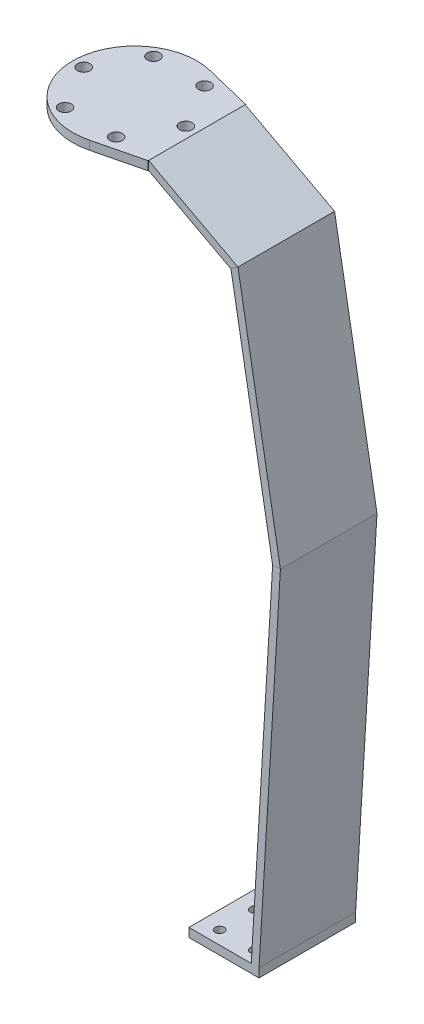
ISO-10303-21;
HEADER;
FILE_DESCRIPTION(('STEP AP214'),'2;1');
FILE_NAME('part.step','',(''),(''),'','','');
FILE_SCHEMA(('AUTOMOTIVE_DESIGN { 1 0 10303 214 1 1 1 1 }'));
ENDSEC;
DATA;
#1=APPLICATION_CONTEXT('core data for automotive mechanical design processes');
#2=APPLICATION_PROTOCOL_DEFINITION('international standard','automotive_design',2000,#1);
#3=PRODUCT_CONTEXT('',#1,'mechanical');
#4=PRODUCT('Part','Part','',(#3));
#5=PRODUCT_RELATED_PRODUCT_CATEGORY('part','',(#4));
#6=PRODUCT_DEFINITION_FORMATION('','',#4);
#7=PRODUCT_DEFINITION_CONTEXT('part definition',#1,'design');
#8=PRODUCT_DEFINITION('design','',#6,#7);
#9=PRODUCT_DEFINITION_SHAPE('','',#8);
#10=(LENGTH_UNIT() NAMED_UNIT(*) SI_UNIT(.MILLI.,.METRE.));
#11=(NAMED_UNIT(*) PLANE_ANGLE_UNIT() SI_UNIT($,.RADIAN.));
#12=(NAMED_UNIT(*) SI_UNIT($,.STERADIAN.) SOLID_ANGLE_UNIT());
#13=UNCERTAINTY_MEASURE_WITH_UNIT(LENGTH_MEASURE(1.E-05),#10,'distance_accuracy_value','');
#14=(GEOMETRIC_REPRESENTATION_CONTEXT(3) GLOBAL_UNCERTAINTY_ASSIGNED_CONTEXT((#13)) GLOBAL_UNIT_ASSIGNED_CONTEXT((#10,
#11,#12)) REPRESENTATION_CONTEXT('',''));
#15=CARTESIAN_POINT('',(0.,0.,0.));
#16=DIRECTION('',(0.,0.,1.));
#17=DIRECTION('',(1.,0.,0.));
#18=AXIS2_PLACEMENT_3D('',#15,#16,#17);
#19=CARTESIAN_POINT('',(62.5,3.175,0.));
#20=DIRECTION('',(1.,0.,0.));
#21=DIRECTION('',(0.,0.,-1.));
#22=AXIS2_PLACEMENT_3D('',#19,#20,#21);
#23=PLANE('',#22);
#24=DIRECTION('',(0.,0.,1.));
#25=VECTOR('',#24,1.);
#26=CARTESIAN_POINT('',(62.5,0.,0.));
#27=LINE('',#26,#25);
#28=CARTESIAN_POINT('',(62.5,0.,-17.5));
#29=VERTEX_POINT('',#28);
#30=CARTESIAN_POINT('',(62.5,0.,17.5));
#31=VERTEX_POINT('',#30);
#32=EDGE_CURVE('E374',#29,#31,#27,.T.);
#33=ORIENTED_EDGE('',*,*,#32,.F.);
#34=DIRECTION('',(0.,-1.,0.));
#35=VECTOR('',#34,1.);
#36=CARTESIAN_POINT('',(62.5,3.175,-17.5));
#37=LINE('',#36,#35);
#38=CARTESIAN_POINT('',(62.4999999999999,3.17499999999939,-17.5));
#39=VERTEX_POINT('',#38);
#40=EDGE_CURVE('E47',#39,#29,#37,.T.);
#41=ORIENTED_EDGE('',*,*,#40,.F.);
#42=DIRECTION('',(0.,0.,1.));
#43=VECTOR('',#42,1.);
#44=CARTESIAN_POINT('',(62.5,3.175,0.));
#45=LINE('',#44,#43);
#46=CARTESIAN_POINT('',(62.5,3.175,17.5));
#47=VERTEX_POINT('',#46);
#48=EDGE_CURVE('E348',#39,#47,#45,.T.);
#49=ORIENTED_EDGE('',*,*,#48,.T.);
#50=DIRECTION('',(0.,-1.,0.));
#51=VECTOR('',#50,1.);
#52=CARTESIAN_POINT('',(62.5,3.175,17.5));
#53=LINE('',#52,#51);
#54=EDGE_CURVE('E79',#47,#31,#53,.T.);
#55=ORIENTED_EDGE('',*,*,#54,.T.);
#56=EDGE_LOOP('',(#33,#41,#49,#55));
#57=FACE_BOUND('',#56,.T.);
#58=ADVANCED_FACE('F38',(#57),#23,.T.);
#59=CARTESIAN_POINT('',(0.,3.175,-17.5));
#60=DIRECTION('',(0.,0.,-1.));
#61=DIRECTION('',(-1.,0.,0.));
#62=AXIS2_PLACEMENT_3D('',#59,#60,#61);
#63=PLANE('',#62);
#64=DIRECTION('',(-0.0599775244877058,-0.998199727788145,0.));
#65=VECTOR('',#64,1.);
#66=CARTESIAN_POINT('',(70.332811374493,133.535668410673,-17.5));
#67=LINE('',#66,#65);
#68=CARTESIAN_POINT('',(70.2499999999999,132.157447282295,-17.5));
#69=VERTEX_POINT('',#68);
#70=EDGE_CURVE('E247',#69,#39,#67,.T.);
#71=ORIENTED_EDGE('',*,*,#70,.T.);
#72=ORIENTED_EDGE('',*,*,#40,.T.);
#73=DIRECTION('',(1.,0.,0.));
#74=VECTOR('',#73,1.);
#75=CARTESIAN_POINT('',(0.,0.,-17.5));
#76=LINE('',#75,#74);
#77=CARTESIAN_POINT('',(37.1,0.,-17.5));
#78=VERTEX_POINT('',#77);
#79=EDGE_CURVE('E376',#78,#29,#76,.T.);
#80=ORIENTED_EDGE('',*,*,#79,.F.);
#81=DIRECTION('',(0.,-1.,0.));
#82=VECTOR('',#81,1.);
#83=CARTESIAN_POINT('',(37.1,3.175,-17.5));
#84=LINE('',#83,#82);
#85=CARTESIAN_POINT('',(37.1,3.175,-17.5));
#86=VERTEX_POINT('',#85);
#87=EDGE_CURVE('E85',#86,#78,#84,.T.);
#88=ORIENTED_EDGE('',*,*,#87,.F.);
#89=DIRECTION('',(1.,0.,0.));
#90=VECTOR('',#89,1.);
#91=CARTESIAN_POINT('',(0.,3.175,-17.5));
#92=LINE('',#91,#90);
#93=CARTESIAN_POINT('',(59.6938019967837,3.17500000000001,-17.4999999999999));
#94=VERTEX_POINT('',#93);
#95=EDGE_CURVE('E350',#86,#94,#92,.T.);
#96=ORIENTED_EDGE('',*,*,#95,.T.);
#97=DIRECTION('',(-0.0599775244877058,-0.998199727788145,0.));
#98=VECTOR('',#97,1.);
#99=CARTESIAN_POINT('',(67.4470581556219,132.211639196579,-17.4999999999999));
#100=LINE('',#99,#98);
#101=CARTESIAN_POINT('',(67.4340773466236,131.995600936928,-17.4999999999999));
#102=VERTEX_POINT('',#101);
#103=EDGE_CURVE('E323',#102,#94,#100,.T.);
#104=ORIENTED_EDGE('',*,*,#103,.F.);
#105=DIRECTION('',(-0.998352368877534,-0.057380724608681,0.));
#106=VECTOR('',#105,1.);
#107=CARTESIAN_POINT('',(59.881093203638,131.56148997912,-17.4999999999998));
#108=LINE('',#107,#106);
#109=EDGE_CURVE('E309',#69,#102,#108,.T.);
#110=ORIENTED_EDGE('',*,*,#109,.F.);
#111=EDGE_LOOP('',(#71,#72,#80,#88,#96,#104,#110));
#112=FACE_BOUND('',#111,.T.);
#113=ADVANCED_FACE('F386',(#112),#63,.T.);
#114=CARTESIAN_POINT('',(37.1,3.175,0.));
#115=DIRECTION('',(1.,0.,0.));
#116=DIRECTION('',(0.,0.,-1.));
#117=AXIS2_PLACEMENT_3D('',#114,#115,#116);
#118=PLANE('',#117);
#119=DIRECTION('',(0.,0.,1.));
#120=VECTOR('',#119,1.);
#121=CARTESIAN_POINT('',(37.1,0.,0.));
#122=LINE('',#121,#120);
#123=CARTESIAN_POINT('',(37.1,0.,17.5));
#124=VERTEX_POINT('',#123);
#125=EDGE_CURVE('E379',#78,#124,#122,.T.);
#126=ORIENTED_EDGE('',*,*,#125,.T.);
#127=DIRECTION('',(0.,-1.,0.));
#128=VECTOR('',#127,1.);
#129=CARTESIAN_POINT('',(37.1,3.175,17.5));
#130=LINE('',#129,#128);
#131=CARTESIAN_POINT('',(37.1,3.175,17.5));
#132=VERTEX_POINT('',#131);
#133=EDGE_CURVE('E73',#132,#124,#130,.T.);
#134=ORIENTED_EDGE('',*,*,#133,.F.);
#135=DIRECTION('',(0.,0.,1.));
#136=VECTOR('',#135,1.);
#137=CARTESIAN_POINT('',(37.1,3.175,0.));
#138=LINE('',#137,#136);
#139=EDGE_CURVE('E352',#86,#132,#138,.T.);
#140=ORIENTED_EDGE('',*,*,#139,.F.);
#141=ORIENTED_EDGE('',*,*,#87,.T.);
#142=EDGE_LOOP('',(#126,#134,#140,#141));
#143=FACE_BOUND('',#142,.T.);
#144=ADVANCED_FACE('F392',(#143),#118,.F.);
#145=CARTESIAN_POINT('',(43.45,3.175,0.));
#146=DIRECTION('',(0.,-1.,0.));
#147=DIRECTION('',(0.,0.,-1.));
#148=AXIS2_PLACEMENT_3D('',#145,#146,#147);
#149=CYLINDRICAL_SURFACE('',#148,1.62999999999999);
#150=CARTESIAN_POINT('',(43.45,3.175,0.));
#151=DIRECTION('',(0.,1.,0.));
#152=DIRECTION('',(0.,0.,1.));
#153=AXIS2_PLACEMENT_3D('',#150,#151,#152);
#154=CIRCLE('',#153,1.62999999999999);
#155=CARTESIAN_POINT('',(43.45,3.175,1.62999999999999));
#156=VERTEX_POINT('',#155);
#157=EDGE_CURVE('E345',#156,#156,#154,.T.);
#158=ORIENTED_EDGE('',*,*,#157,.T.);
#159=EDGE_LOOP('',(#158));
#160=FACE_BOUND('',#159,.T.);
#161=CARTESIAN_POINT('',(43.45,0.,0.));
#162=DIRECTION('',(0.,1.,0.));
#163=DIRECTION('',(0.,0.,1.));
#164=AXIS2_PLACEMENT_3D('',#161,#162,#163);
#165=CIRCLE('',#164,1.62999999999999);
#166=CARTESIAN_POINT('',(43.45,0.,1.62999999999999));
#167=VERTEX_POINT('',#166);
#168=EDGE_CURVE('E371',#167,#167,#165,.T.);
#169=ORIENTED_EDGE('',*,*,#168,.F.);
#170=EDGE_LOOP('',(#169));
#171=FACE_BOUND('',#170,.T.);
#172=ADVANCED_FACE('F474',(#160,#171),#149,.F.);
#173=CARTESIAN_POINT('',(56.15,3.175,0.));
#174=DIRECTION('',(0.,-1.,0.));
#175=DIRECTION('',(0.,0.,-1.));
#176=AXIS2_PLACEMENT_3D('',#173,#174,#175);
#177=CYLINDRICAL_SURFACE('',#176,1.63000000000001);
#178=CARTESIAN_POINT('',(56.15,3.175,0.));
#179=DIRECTION('',(0.,1.,0.));
#180=DIRECTION('',(0.,0.,1.));
#181=AXIS2_PLACEMENT_3D('',#178,#179,#180);
#182=CIRCLE('',#181,1.63000000000001);
#183=CARTESIAN_POINT('',(56.15,3.175,1.63000000000001));
#184=VERTEX_POINT('',#183);
#185=EDGE_CURVE('E342',#184,#184,#182,.T.);
#186=ORIENTED_EDGE('',*,*,#185,.T.);
#187=EDGE_LOOP('',(#186));
#188=FACE_BOUND('',#187,.T.);
#189=CARTESIAN_POINT('',(56.15,0.,0.));
#190=DIRECTION('',(0.,1.,0.));
#191=DIRECTION('',(0.,0.,1.));
#192=AXIS2_PLACEMENT_3D('',#189,#190,#191);
#193=CIRCLE('',#192,1.63000000000001);
#194=CARTESIAN_POINT('',(56.15,0.,1.63000000000001));
#195=VERTEX_POINT('',#194);
#196=EDGE_CURVE('E368',#195,#195,#193,.T.);
#197=ORIENTED_EDGE('',*,*,#196,.F.);
#198=EDGE_LOOP('',(#197));
#199=FACE_BOUND('',#198,.T.);
#200=ADVANCED_FACE('F477',(#188,#199),#177,.F.);
#201=CARTESIAN_POINT('',(43.45,3.175,-12.7));
#202=DIRECTION('',(0.,-1.,0.));
#203=DIRECTION('',(0.,0.,-1.));
#204=AXIS2_PLACEMENT_3D('',#201,#202,#203);
#205=CYLINDRICAL_SURFACE('',#204,1.63);
#206=CARTESIAN_POINT('',(43.45,3.175,-12.7));
#207=DIRECTION('',(0.,1.,0.));
#208=DIRECTION('',(0.,0.,1.));
#209=AXIS2_PLACEMENT_3D('',#206,#207,#208);
#210=CIRCLE('',#209,1.63);
#211=CARTESIAN_POINT('',(43.45,3.175,-11.07));
#212=VERTEX_POINT('',#211);
#213=EDGE_CURVE('E339',#212,#212,#210,.T.);
#214=ORIENTED_EDGE('',*,*,#213,.T.);
#215=EDGE_LOOP('',(#214));
#216=FACE_BOUND('',#215,.T.);
#217=CARTESIAN_POINT('',(43.45,0.,-12.7));
#218=DIRECTION('',(0.,1.,0.));
#219=DIRECTION('',(0.,0.,1.));
#220=AXIS2_PLACEMENT_3D('',#217,#218,#219);
#221=CIRCLE('',#220,1.63);
#222=CARTESIAN_POINT('',(43.45,0.,-11.07));
#223=VERTEX_POINT('',#222);
#224=EDGE_CURVE('E365',#223,#223,#221,.T.);
#225=ORIENTED_EDGE('',*,*,#224,.F.);
#226=EDGE_LOOP('',(#225));
#227=FACE_BOUND('',#226,.T.);
#228=ADVANCED_FACE('F481',(#216,#227),#205,.F.);
#229=CARTESIAN_POINT('',(56.15,3.175,-12.7));
#230=DIRECTION('',(0.,-1.,0.));
#231=DIRECTION('',(0.,0.,-1.));
#232=AXIS2_PLACEMENT_3D('',#229,#230,#231);
#233=CYLINDRICAL_SURFACE('',#232,1.63000000000001);
#234=CARTESIAN_POINT('',(56.15,3.175,-12.7));
#235=DIRECTION('',(0.,1.,0.));
#236=DIRECTION('',(0.,0.,1.));
#237=AXIS2_PLACEMENT_3D('',#234,#235,#236);
#238=CIRCLE('',#237,1.63000000000001);
#239=CARTESIAN_POINT('',(56.15,3.175,-11.07));
#240=VERTEX_POINT('',#239);
#241=EDGE_CURVE('E336',#240,#240,#238,.T.);
#242=ORIENTED_EDGE('',*,*,#241,.T.);
#243=EDGE_LOOP('',(#242));
#244=FACE_BOUND('',#243,.T.);
#245=CARTESIAN_POINT('',(56.15,0.,-12.7));
#246=DIRECTION('',(0.,1.,0.));
#247=DIRECTION('',(0.,0.,1.));
#248=AXIS2_PLACEMENT_3D('',#245,#246,#247);
#249=CIRCLE('',#248,1.63000000000001);
#250=CARTESIAN_POINT('',(56.15,0.,-11.07));
#251=VERTEX_POINT('',#250);
#252=EDGE_CURVE('E362',#251,#251,#249,.T.);
#253=ORIENTED_EDGE('',*,*,#252,.F.);
#254=EDGE_LOOP('',(#253));
#255=FACE_BOUND('',#254,.T.);
#256=ADVANCED_FACE('F485',(#244,#255),#233,.F.);
#257=CARTESIAN_POINT('',(43.4500000000001,3.175,12.7));
#258=DIRECTION('',(0.,-1.,0.));
#259=DIRECTION('',(0.,0.,-1.));
#260=AXIS2_PLACEMENT_3D('',#257,#258,#259);
#261=CYLINDRICAL_SURFACE('',#260,1.63);
#262=CARTESIAN_POINT('',(43.4500000000001,3.175,12.7));
#263=DIRECTION('',(0.,1.,0.));
#264=DIRECTION('',(0.,0.,1.));
#265=AXIS2_PLACEMENT_3D('',#262,#263,#264);
#266=CIRCLE('',#265,1.63);
#267=CARTESIAN_POINT('',(43.4500000000001,3.175,14.33));
#268=VERTEX_POINT('',#267);
#269=EDGE_CURVE('E332',#268,#268,#266,.T.);
#270=ORIENTED_EDGE('',*,*,#269,.T.);
#271=EDGE_LOOP('',(#270));
#272=FACE_BOUND('',#271,.T.);
#273=CARTESIAN_POINT('',(43.4500000000001,0.,12.7));
#274=DIRECTION('',(0.,1.,0.));
#275=DIRECTION('',(0.,0.,1.));
#276=AXIS2_PLACEMENT_3D('',#273,#274,#275);
#277=CIRCLE('',#276,1.63);
#278=CARTESIAN_POINT('',(43.4500000000001,0.,14.33));
#279=VERTEX_POINT('',#278);
#280=EDGE_CURVE('E359',#279,#279,#277,.T.);
#281=ORIENTED_EDGE('',*,*,#280,.F.);
#282=EDGE_LOOP('',(#281));
#283=FACE_BOUND('',#282,.T.);
#284=ADVANCED_FACE('F488',(#272,#283),#261,.F.);
#285=CARTESIAN_POINT('',(56.1500000000002,3.175,12.7));
#286=DIRECTION('',(0.,-1.,0.));
#287=DIRECTION('',(0.,0.,-1.));
#288=AXIS2_PLACEMENT_3D('',#285,#286,#287);
#289=CYLINDRICAL_SURFACE('',#288,1.63000000000001);
#290=CARTESIAN_POINT('',(56.1500000000002,3.175,12.7));
#291=DIRECTION('',(0.,1.,0.));
#292=DIRECTION('',(0.,0.,1.));
#293=AXIS2_PLACEMENT_3D('',#290,#291,#292);
#294=CIRCLE('',#293,1.63000000000001);
#295=CARTESIAN_POINT('',(56.1500000000002,3.175,14.33));
#296=VERTEX_POINT('',#295);
#297=EDGE_CURVE('E329',#296,#296,#294,.T.);
#298=ORIENTED_EDGE('',*,*,#297,.T.);
#299=EDGE_LOOP('',(#298));
#300=FACE_BOUND('',#299,.T.);
#301=CARTESIAN_POINT('',(56.1500000000002,0.,12.7));
#302=DIRECTION('',(0.,1.,0.));
#303=DIRECTION('',(0.,0.,1.));
#304=AXIS2_PLACEMENT_3D('',#301,#302,#303);
#305=CIRCLE('',#304,1.63000000000001);
#306=CARTESIAN_POINT('',(56.1500000000002,0.,14.33));
#307=VERTEX_POINT('',#306);
#308=EDGE_CURVE('E285',#307,#307,#305,.T.);
#309=ORIENTED_EDGE('',*,*,#308,.F.);
#310=EDGE_LOOP('',(#309));
#311=FACE_BOUND('',#310,.T.);
#312=ADVANCED_FACE('F40',(#300,#311),#289,.F.);
#313=CARTESIAN_POINT('',(0.,3.175,17.5));
#314=DIRECTION('',(0.,0.,1.));
#315=DIRECTION('',(1.,0.,0.));
#316=AXIS2_PLACEMENT_3D('',#313,#314,#315);
#317=PLANE('',#316);
#318=ORIENTED_EDGE('',*,*,#54,.F.);
#319=DIRECTION('',(-0.0599775244877058,-0.998199727788145,0.));
#320=VECTOR('',#319,1.);
#321=CARTESIAN_POINT('',(70.3328113744933,133.535668410674,17.5));
#322=LINE('',#321,#320);
#323=CARTESIAN_POINT('',(70.2500000000001,132.157447282296,17.5));
#324=VERTEX_POINT('',#323);
#325=EDGE_CURVE('E55',#324,#47,#322,.T.);
#326=ORIENTED_EDGE('',*,*,#325,.F.);
#327=DIRECTION('',(0.998352368877534,0.057380724608681,0.));
#328=VECTOR('',#327,1.);
#329=CARTESIAN_POINT('',(59.8810932036381,131.561489979121,17.5000000000002));
#330=LINE('',#329,#328);
#331=CARTESIAN_POINT('',(67.4340773466239,131.995600936928,17.5000000000001));
#332=VERTEX_POINT('',#331);
#333=EDGE_CURVE('E303',#332,#324,#330,.T.);
#334=ORIENTED_EDGE('',*,*,#333,.F.);
#335=DIRECTION('',(-0.0599775244877058,-0.998199727788145,0.));
#336=VECTOR('',#335,1.);
#337=CARTESIAN_POINT('',(67.4470581556222,132.21163919658,17.5000000000001));
#338=LINE('',#337,#336);
#339=CARTESIAN_POINT('',(59.6938019967839,3.17499999999998,17.5000000000001));
#340=VERTEX_POINT('',#339);
#341=EDGE_CURVE('E325',#332,#340,#338,.T.);
#342=ORIENTED_EDGE('',*,*,#341,.T.);
#343=DIRECTION('',(-1.,0.,0.));
#344=VECTOR('',#343,1.);
#345=CARTESIAN_POINT('',(0.,3.175,17.5));
#346=LINE('',#345,#344);
#347=EDGE_CURVE('E355',#340,#132,#346,.T.);
#348=ORIENTED_EDGE('',*,*,#347,.T.);
#349=ORIENTED_EDGE('',*,*,#133,.T.);
#350=DIRECTION('',(-1.,0.,0.));
#351=VECTOR('',#350,1.);
#352=CARTESIAN_POINT('',(0.,0.,17.5));
#353=LINE('',#352,#351);
#354=EDGE_CURVE('E333',#31,#124,#353,.T.);
#355=ORIENTED_EDGE('',*,*,#354,.F.);
#356=EDGE_LOOP('',(#318,#326,#334,#342,#348,#349,#355));
#357=FACE_BOUND('',#356,.T.);
#358=ADVANCED_FACE('F495',(#357),#317,.T.);
#359=CARTESIAN_POINT('',(0.,3.175,0.));
#360=DIRECTION('',(0.,1.,0.));
#361=DIRECTION('',(0.,0.,1.));
#362=AXIS2_PLACEMENT_3D('',#359,#360,#361);
#363=PLANE('',#362);
#364=DIRECTION('',(0.,0.,1.));
#365=VECTOR('',#364,1.);
#366=CARTESIAN_POINT('',(59.6938019967838,3.175,-4.36760875243441E-13));
#367=LINE('',#366,#365);
#368=EDGE_CURVE('E11',#94,#340,#367,.T.);
#369=ORIENTED_EDGE('',*,*,#368,.F.);
#370=ORIENTED_EDGE('',*,*,#95,.F.);
#371=ORIENTED_EDGE('',*,*,#139,.T.);
#372=ORIENTED_EDGE('',*,*,#347,.F.);
#373=EDGE_LOOP('',(#369,#370,#371,#372));
#374=FACE_BOUND('',#373,.T.);
#375=ORIENTED_EDGE('',*,*,#297,.F.);
#376=EDGE_LOOP('',(#375));
#377=FACE_BOUND('',#376,.T.);
#378=ORIENTED_EDGE('',*,*,#269,.F.);
#379=EDGE_LOOP('',(#378));
#380=FACE_BOUND('',#379,.T.);
#381=ORIENTED_EDGE('',*,*,#241,.F.);
#382=EDGE_LOOP('',(#381));
#383=FACE_BOUND('',#382,.T.);
#384=ORIENTED_EDGE('',*,*,#213,.F.);
#385=EDGE_LOOP('',(#384));
#386=FACE_BOUND('',#385,.T.);
#387=ORIENTED_EDGE('',*,*,#185,.F.);
#388=EDGE_LOOP('',(#387));
#389=FACE_BOUND('',#388,.T.);
#390=ORIENTED_EDGE('',*,*,#157,.F.);
#391=EDGE_LOOP('',(#390));
#392=FACE_BOUND('',#391,.T.);
#393=ADVANCED_FACE('F397',(#374,#377,#380,#383,#386,#389,#392),#363,.T.);
#394=CARTESIAN_POINT('',(0.,0.,0.));
#395=DIRECTION('',(0.,1.,0.));
#396=DIRECTION('',(0.,0.,1.));
#397=AXIS2_PLACEMENT_3D('',#394,#395,#396);
#398=PLANE('',#397);
#399=ORIENTED_EDGE('',*,*,#308,.T.);
#400=EDGE_LOOP('',(#399));
#401=FACE_BOUND('',#400,.T.);
#402=ORIENTED_EDGE('',*,*,#280,.T.);
#403=EDGE_LOOP('',(#402));
#404=FACE_BOUND('',#403,.T.);
#405=ORIENTED_EDGE('',*,*,#252,.T.);
#406=EDGE_LOOP('',(#405));
#407=FACE_BOUND('',#406,.T.);
#408=ORIENTED_EDGE('',*,*,#224,.T.);
#409=EDGE_LOOP('',(#408));
#410=FACE_BOUND('',#409,.T.);
#411=ORIENTED_EDGE('',*,*,#196,.T.);
#412=EDGE_LOOP('',(#411));
#413=FACE_BOUND('',#412,.T.);
#414=ORIENTED_EDGE('',*,*,#168,.T.);
#415=EDGE_LOOP('',(#414));
#416=FACE_BOUND('',#415,.T.);
#417=ORIENTED_EDGE('',*,*,#32,.T.);
#418=ORIENTED_EDGE('',*,*,#354,.T.);
#419=ORIENTED_EDGE('',*,*,#125,.F.);
#420=ORIENTED_EDGE('',*,*,#79,.T.);
#421=EDGE_LOOP('',(#417,#418,#419,#420));
#422=FACE_BOUND('',#421,.T.);
#423=ADVANCED_FACE('F390',(#401,#404,#407,#410,#413,#416,#422),#398,.F.);
#424=CARTESIAN_POINT('',(67.4470581556222,132.21163919658,17.5000000000001));
#425=DIRECTION('',(-0.998199727788145,0.0599775244877058,0.));
#426=DIRECTION('',(-0.0599775244877058,-0.998199727788145,0.));
#427=AXIS2_PLACEMENT_3D('',#424,#425,#426);
#428=PLANE('',#427);
#429=ORIENTED_EDGE('',*,*,#103,.T.);
#430=ORIENTED_EDGE('',*,*,#368,.T.);
#431=ORIENTED_EDGE('',*,*,#341,.F.);
#432=DIRECTION('',(0.,0.,1.));
#433=VECTOR('',#432,1.);
#434=CARTESIAN_POINT('',(67.4340773466239,131.995600936928,17.4999999999994));
#435=LINE('',#434,#433);
#436=EDGE_CURVE('E312',#102,#332,#435,.T.);
#437=ORIENTED_EDGE('',*,*,#436,.F.);
#438=EDGE_LOOP('',(#429,#430,#431,#437));
#439=FACE_BOUND('',#438,.T.);
#440=ADVANCED_FACE('F503',(#439),#428,.T.);
#441=CARTESIAN_POINT('',(70.3328113744933,133.535668410674,17.5));
#442=DIRECTION('',(0.998199727788145,-0.0599775244877058,0.));
#443=DIRECTION('',(0.0599775244877058,0.998199727788145,0.));
#444=AXIS2_PLACEMENT_3D('',#441,#442,#443);
#445=PLANE('',#444);
#446=DIRECTION('',(0.,0.,1.));
#447=VECTOR('',#446,1.);
#448=CARTESIAN_POINT('',(70.25,132.157447282297,17.5));
#449=LINE('',#448,#447);
#450=EDGE_CURVE('E290',#69,#324,#449,.T.);
#451=ORIENTED_EDGE('',*,*,#450,.T.);
#452=ORIENTED_EDGE('',*,*,#325,.T.);
#453=ORIENTED_EDGE('',*,*,#48,.F.);
#454=ORIENTED_EDGE('',*,*,#70,.F.);
#455=EDGE_LOOP('',(#451,#452,#453,#454));
#456=FACE_BOUND('',#455,.T.);
#457=ADVANCED_FACE('F521',(#456),#445,.T.);
#458=CARTESIAN_POINT('',(54.8292597054871,219.457032854347,17.4999999999989));
#459=DIRECTION('',(0.984754720830328,0.173948670021886,0.));
#460=DIRECTION('',(-0.173948670021887,0.984754720830328,0.));
#461=AXIS2_PLACEMENT_3D('',#458,#459,#460);
#462=PLANE('',#461);
#463=DIRECTION('',(0.,0.,1.));
#464=VECTOR('',#463,1.);
#465=CARTESIAN_POINT('',(54.8718379232392,219.215989902246,17.4999999999989));
#466=LINE('',#465,#464);
#467=CARTESIAN_POINT('',(54.8718379232391,219.215989902246,-17.5000000000011));
#468=VERTEX_POINT('',#467);
#469=CARTESIAN_POINT('',(54.8718379232393,219.215989902246,17.4999999999989));
#470=VERTEX_POINT('',#469);
#471=EDGE_CURVE('E265',#468,#470,#466,.T.);
#472=ORIENTED_EDGE('',*,*,#471,.T.);
#473=DIRECTION('',(0.173948670021886,-0.984754720830328,0.));
#474=VECTOR('',#473,1.);
#475=CARTESIAN_POINT('',(54.8292597054871,219.457032854347,17.4999999999989));
#476=LINE('',#475,#474);
#477=EDGE_CURVE('E299',#470,#324,#476,.T.);
#478=ORIENTED_EDGE('',*,*,#477,.T.);
#479=ORIENTED_EDGE('',*,*,#450,.F.);
#480=DIRECTION('',(0.173948670021886,-0.984754720830328,0.));
#481=VECTOR('',#480,1.);
#482=CARTESIAN_POINT('',(54.8292597054871,219.457032854345,-17.5000000000011));
#483=LINE('',#482,#481);
#484=EDGE_CURVE('E304',#468,#69,#483,.T.);
#485=ORIENTED_EDGE('',*,*,#484,.F.);
#486=EDGE_LOOP('',(#472,#478,#479,#485));
#487=FACE_BOUND('',#486,.T.);
#488=ADVANCED_FACE('F536',(#487),#462,.T.);
#489=CARTESIAN_POINT('',(54.8292597054871,219.457032854347,17.4999999999989));
#490=DIRECTION('',(0.,0.,1.));
#491=DIRECTION('',(1.,0.,0.));
#492=AXIS2_PLACEMENT_3D('',#489,#490,#491);
#493=PLANE('',#492);
#494=DIRECTION('',(0.173948670021886,-0.984754720830328,0.));
#495=VECTOR('',#494,1.);
#496=CARTESIAN_POINT('',(52.3308234651038,217.497838797409,17.499999999999));
#497=LINE('',#496,#495);
#498=CARTESIAN_POINT('',(52.350507727629,217.386402645323,17.499999999999));
#499=VERTEX_POINT('',#498);
#500=EDGE_CURVE('E302',#499,#332,#497,.T.);
#501=ORIENTED_EDGE('',*,*,#500,.T.);
#502=ORIENTED_EDGE('',*,*,#333,.T.);
#503=ORIENTED_EDGE('',*,*,#477,.F.);
#504=DIRECTION('',(0.8093628081488,0.587308985786434,0.));
#505=VECTOR('',#504,1.);
#506=CARTESIAN_POINT('',(41.8772102413648,209.786520784472,17.4999999999993));
#507=LINE('',#506,#505);
#508=EDGE_CURVE('E268',#499,#470,#507,.T.);
#509=ORIENTED_EDGE('',*,*,#508,.F.);
#510=EDGE_LOOP('',(#501,#502,#503,#509));
#511=FACE_BOUND('',#510,.T.);
#512=ADVANCED_FACE('F539',(#511),#493,.T.);
#513=CARTESIAN_POINT('',(52.3308234651038,217.497838797409,17.499999999999));
#514=DIRECTION('',(-0.984754720830328,-0.173948670021886,0.));
#515=DIRECTION('',(0.173948670021887,-0.984754720830328,0.));
#516=AXIS2_PLACEMENT_3D('',#513,#514,#515);
#517=PLANE('',#516);
#518=DIRECTION('',(0.173948670021886,-0.984754720830328,0.));
#519=VECTOR('',#518,1.);
#520=CARTESIAN_POINT('',(52.3308234651038,217.497838797408,-17.500000000001));
#521=LINE('',#520,#519);
#522=CARTESIAN_POINT('',(52.3505077276288,217.386402645323,-17.500000000001));
#523=VERTEX_POINT('',#522);
#524=EDGE_CURVE('E307',#523,#102,#521,.T.);
#525=ORIENTED_EDGE('',*,*,#524,.T.);
#526=ORIENTED_EDGE('',*,*,#436,.T.);
#527=ORIENTED_EDGE('',*,*,#500,.F.);
#528=DIRECTION('',(0.,0.,1.));
#529=VECTOR('',#528,1.);
#530=CARTESIAN_POINT('',(52.3505077276291,217.386402645323,17.4999999999996));
#531=LINE('',#530,#529);
#532=EDGE_CURVE('E289',#523,#499,#531,.T.);
#533=ORIENTED_EDGE('',*,*,#532,.F.);
#534=EDGE_LOOP('',(#525,#526,#527,#533));
#535=FACE_BOUND('',#534,.T.);
#536=ADVANCED_FACE('F406',(#535),#517,.T.);
#537=CARTESIAN_POINT('',(54.8292597054871,219.457032854345,-17.5000000000011));
#538=DIRECTION('',(0.,0.,-1.));
#539=DIRECTION('',(-1.,0.,0.));
#540=AXIS2_PLACEMENT_3D('',#537,#538,#539);
#541=PLANE('',#540);
#542=ORIENTED_EDGE('',*,*,#484,.T.);
#543=ORIENTED_EDGE('',*,*,#109,.T.);
#544=ORIENTED_EDGE('',*,*,#524,.F.);
#545=DIRECTION('',(-0.8093628081488,-0.587308985786434,0.));
#546=VECTOR('',#545,1.);
#547=CARTESIAN_POINT('',(41.8772102413646,209.786520784473,-17.5000000000007));
#548=LINE('',#547,#546);
#549=EDGE_CURVE('E286',#468,#523,#548,.T.);
#550=ORIENTED_EDGE('',*,*,#549,.F.);
#551=EDGE_LOOP('',(#542,#543,#544,#550));
#552=FACE_BOUND('',#551,.T.);
#553=ADVANCED_FACE('F403',(#552),#541,.T.);
#554=CARTESIAN_POINT('',(22.5,236.49,17.5));
#555=DIRECTION('',(0.470779822186716,0.88225073478113,0.));
#556=DIRECTION('',(-0.88225073478113,0.470779822186716,0.));
#557=AXIS2_PLACEMENT_3D('',#554,#555,#556);
#558=PLANE('',#557);
#559=ORIENTED_EDGE('',*,*,#471,.F.);
#560=DIRECTION('',(0.88225073478113,-0.470779822186716,0.));
#561=VECTOR('',#560,1.);
#562=CARTESIAN_POINT('',(22.5,236.49,-17.5));
#563=LINE('',#562,#561);
#564=CARTESIAN_POINT('',(22.5,236.49,-17.5));
#565=VERTEX_POINT('',#564);
#566=EDGE_CURVE('E267',#565,#468,#563,.T.);
#567=ORIENTED_EDGE('',*,*,#566,.F.);
#568=DIRECTION('',(0.,0.,1.));
#569=VECTOR('',#568,1.);
#570=CARTESIAN_POINT('',(22.5,236.49,17.5));
#571=LINE('',#570,#569);
#572=CARTESIAN_POINT('',(22.5,236.49,17.5));
#573=VERTEX_POINT('',#572);
#574=EDGE_CURVE('E269',#565,#573,#571,.T.);
#575=ORIENTED_EDGE('',*,*,#574,.T.);
#576=DIRECTION('',(0.88225073478113,-0.470779822186716,0.));
#577=VECTOR('',#576,1.);
#578=CARTESIAN_POINT('',(22.5,236.49,17.5));
#579=LINE('',#578,#577);
#580=EDGE_CURVE('E272',#573,#470,#579,.T.);
#581=ORIENTED_EDGE('',*,*,#580,.T.);
#582=EDGE_LOOP('',(#559,#567,#575,#581));
#583=FACE_BOUND('',#582,.T.);
#584=ADVANCED_FACE('F417',(#583),#558,.T.);
#585=CARTESIAN_POINT('',(22.5,236.49,17.5));
#586=DIRECTION('',(0.,0.,1.));
#587=DIRECTION('',(1.,0.,0.));
#588=AXIS2_PLACEMENT_3D('',#585,#586,#587);
#589=PLANE('',#588);
#590=DIRECTION('',(0.88225073478113,-0.470779822186716,0.));
#591=VECTOR('',#590,1.);
#592=CARTESIAN_POINT('',(22.5,233.315,17.5));
#593=LINE('',#592,#591);
#594=CARTESIAN_POINT('',(22.5,233.315,17.5));
#595=VERTEX_POINT('',#594);
#596=EDGE_CURVE('E283',#595,#499,#593,.T.);
#597=ORIENTED_EDGE('',*,*,#596,.T.);
#598=ORIENTED_EDGE('',*,*,#508,.T.);
#599=ORIENTED_EDGE('',*,*,#580,.F.);
#600=DIRECTION('',(0.,-1.,0.));
#601=VECTOR('',#600,1.);
#602=CARTESIAN_POINT('',(22.5,236.49,17.5));
#603=LINE('',#602,#601);
#604=EDGE_CURVE('E179',#573,#595,#603,.T.);
#605=ORIENTED_EDGE('',*,*,#604,.T.);
#606=EDGE_LOOP('',(#597,#598,#599,#605));
#607=FACE_BOUND('',#606,.T.);
#608=ADVANCED_FACE('F413',(#607),#589,.T.);
#609=CARTESIAN_POINT('',(22.5,233.315,17.5));
#610=DIRECTION('',(-0.470779822186716,-0.88225073478113,0.));
#611=DIRECTION('',(0.88225073478113,-0.470779822186716,0.));
#612=AXIS2_PLACEMENT_3D('',#609,#610,#611);
#613=PLANE('',#612);
#614=DIRECTION('',(0.88225073478113,-0.470779822186716,0.));
#615=VECTOR('',#614,1.);
#616=CARTESIAN_POINT('',(22.5,233.315,-17.5));
#617=LINE('',#616,#615);
#618=CARTESIAN_POINT('',(22.5,233.315,-17.5));
#619=VERTEX_POINT('',#618);
#620=EDGE_CURVE('E275',#619,#523,#617,.T.);
#621=ORIENTED_EDGE('',*,*,#620,.T.);
#622=ORIENTED_EDGE('',*,*,#532,.T.);
#623=ORIENTED_EDGE('',*,*,#596,.F.);
#624=DIRECTION('',(0.,0.,-1.));
#625=VECTOR('',#624,1.);
#626=CARTESIAN_POINT('',(22.5,233.315,17.5));
#627=LINE('',#626,#625);
#628=EDGE_CURVE('E278',#595,#619,#627,.T.);
#629=ORIENTED_EDGE('',*,*,#628,.T.);
#630=EDGE_LOOP('',(#621,#622,#623,#629));
#631=FACE_BOUND('',#630,.T.);
#632=ADVANCED_FACE('F410',(#631),#613,.T.);
#633=CARTESIAN_POINT('',(22.5,236.49,-17.5));
#634=DIRECTION('',(0.,0.,-1.));
#635=DIRECTION('',(-1.,0.,0.));
#636=AXIS2_PLACEMENT_3D('',#633,#634,#635);
#637=PLANE('',#636);
#638=ORIENTED_EDGE('',*,*,#566,.T.);
#639=ORIENTED_EDGE('',*,*,#549,.T.);
#640=ORIENTED_EDGE('',*,*,#620,.F.);
#641=DIRECTION('',(0.,1.,0.));
#642=VECTOR('',#641,1.);
#643=CARTESIAN_POINT('',(22.5,236.49,-17.5));
#644=LINE('',#643,#642);
#645=EDGE_CURVE('E271',#619,#565,#644,.T.);
#646=ORIENTED_EDGE('',*,*,#645,.T.);
#647=EDGE_LOOP('',(#638,#639,#640,#646));
#648=FACE_BOUND('',#647,.T.);
#649=ADVANCED_FACE('F422',(#648),#637,.T.);
#650=CARTESIAN_POINT('',(22.5,186.368925407933,0.));
#651=DIRECTION('',(-1.,0.,0.));
#652=DIRECTION('',(0.,0.,1.));
#653=AXIS2_PLACEMENT_3D('',#650,#651,#652);
#654=PLANE('',#653);
#655=ORIENTED_EDGE('',*,*,#604,.F.);
#656=DIRECTION('',(0.,0.,1.));
#657=VECTOR('',#656,1.);
#658=CARTESIAN_POINT('',(22.5,236.49,0.));
#659=LINE('',#658,#657);
#660=CARTESIAN_POINT('',(22.5,236.49,17.6488599569222));
#661=VERTEX_POINT('',#660);
#662=EDGE_CURVE('E173',#573,#661,#659,.T.);
#663=ORIENTED_EDGE('',*,*,#662,.T.);
#664=DIRECTION('',(0.,1.,0.));
#665=VECTOR('',#664,1.);
#666=CARTESIAN_POINT('',(22.5,186.368925407933,17.6488599569222));
#667=LINE('',#666,#665);
#668=CARTESIAN_POINT('',(22.5,233.315,17.6488599569222));
#669=VERTEX_POINT('',#668);
#670=EDGE_CURVE('E177',#669,#661,#667,.T.);
#671=ORIENTED_EDGE('',*,*,#670,.F.);
#672=DIRECTION('',(0.,0.,-1.));
#673=VECTOR('',#672,1.);
#674=CARTESIAN_POINT('',(22.5,233.315,0.));
#675=LINE('',#674,#673);
#676=EDGE_CURVE('E435',#669,#595,#675,.T.);
#677=ORIENTED_EDGE('',*,*,#676,.T.);
#678=EDGE_LOOP('',(#655,#663,#671,#677));
#679=FACE_BOUND('',#678,.T.);
#680=ADVANCED_FACE('F175',(#679),#654,.F.);
#681=CARTESIAN_POINT('',(0.,233.315,0.));
#682=DIRECTION('',(0.,1.,0.));
#683=DIRECTION('',(0.,0.,1.));
#684=AXIS2_PLACEMENT_3D('',#681,#682,#683);
#685=CYLINDRICAL_SURFACE('',#684,22.5);
#686=CARTESIAN_POINT('',(0.,236.49,0.));
#687=DIRECTION('',(0.,1.,0.));
#688=DIRECTION('',(0.,0.,1.));
#689=AXIS2_PLACEMENT_3D('',#686,#687,#688);
#690=CIRCLE('',#689,22.5);
#691=CARTESIAN_POINT('',(5.35905751336446,236.49,-21.8524713148983));
#692=VERTEX_POINT('',#691);
#693=CARTESIAN_POINT('',(5.35905751336442,236.49,21.8524713148983));
#694=VERTEX_POINT('',#693);
#695=EDGE_CURVE('E201',#692,#694,#690,.T.);
#696=ORIENTED_EDGE('',*,*,#695,.F.);
#697=DIRECTION('',(0.,1.,0.));
#698=VECTOR('',#697,1.);
#699=CARTESIAN_POINT('',(5.35905751336448,186.368925407933,-21.8524713148982));
#700=LINE('',#699,#698);
#701=CARTESIAN_POINT('',(5.35905751336446,233.315,-21.8524713148983));
#702=VERTEX_POINT('',#701);
#703=EDGE_CURVE('E214',#702,#692,#700,.T.);
#704=ORIENTED_EDGE('',*,*,#703,.F.);
#705=CARTESIAN_POINT('',(0.,233.315,0.));
#706=DIRECTION('',(0.,1.,0.));
#707=DIRECTION('',(0.,0.,1.));
#708=AXIS2_PLACEMENT_3D('',#705,#706,#707);
#709=CIRCLE('',#708,22.5);
#710=CARTESIAN_POINT('',(5.35905751336442,233.315,21.8524713148983));
#711=VERTEX_POINT('',#710);
#712=EDGE_CURVE('E236',#702,#711,#709,.T.);
#713=ORIENTED_EDGE('',*,*,#712,.T.);
#714=DIRECTION('',(0.,1.,0.));
#715=VECTOR('',#714,1.);
#716=CARTESIAN_POINT('',(5.35905751336448,186.368925407933,21.8524713148982));
#717=LINE('',#716,#715);
#718=EDGE_CURVE('E195',#711,#694,#717,.T.);
#719=ORIENTED_EDGE('',*,*,#718,.T.);
#720=EDGE_LOOP('',(#696,#704,#713,#719));
#721=FACE_BOUND('',#720,.T.);
#722=ADVANCED_FACE('F531',(#721),#685,.T.);
#723=CARTESIAN_POINT('',(18.5000000000009,233.315,-6.39520003291815E-13));
#724=DIRECTION('',(0.,1.,0.));
#725=DIRECTION('',(0.,0.,1.));
#726=AXIS2_PLACEMENT_3D('',#723,#724,#725);
#727=CYLINDRICAL_SURFACE('',#726,2.24999999999973);
#728=CARTESIAN_POINT('',(18.5000000000009,236.49,-6.39520003291815E-13));
#729=DIRECTION('',(0.,1.,0.));
#730=DIRECTION('',(0.,0.,1.));
#731=AXIS2_PLACEMENT_3D('',#728,#729,#730);
#732=CIRCLE('',#731,2.24999999999973);
#733=CARTESIAN_POINT('',(20.6834487157861,236.49,-0.543186621277867));
#734=VERTEX_POINT('',#733);
#735=CARTESIAN_POINT('',(20.6834487157864,236.49,0.543186621275346));
#736=VERTEX_POINT('',#735);
#737=EDGE_CURVE('E250',#734,#736,#732,.T.);
#738=ORIENTED_EDGE('',*,*,#737,.T.);
#739=DIRECTION('',(0.,1.,0.));
#740=VECTOR('',#739,1.);
#741=CARTESIAN_POINT('',(20.6834487157865,233.315,0.543186621275343));
#742=LINE('',#741,#740);
#743=CARTESIAN_POINT('',(20.6834487157864,233.315,0.543186621275346));
#744=VERTEX_POINT('',#743);
#745=EDGE_CURVE('E221',#736,#744,#742,.F.);
#746=ORIENTED_EDGE('',*,*,#745,.T.);
#747=CARTESIAN_POINT('',(18.5000000000009,233.315,-6.39520003291815E-13));
#748=DIRECTION('',(0.,1.,0.));
#749=DIRECTION('',(0.,0.,1.));
#750=AXIS2_PLACEMENT_3D('',#747,#748,#749);
#751=CIRCLE('',#750,2.24999999999973);
#752=CARTESIAN_POINT('',(20.6834487157861,233.315,-0.543186621277867));
#753=VERTEX_POINT('',#752);
#754=EDGE_CURVE('E229',#753,#744,#751,.T.);
#755=ORIENTED_EDGE('',*,*,#754,.F.);
#756=DIRECTION('',(0.,1.,0.));
#757=VECTOR('',#756,1.);
#758=CARTESIAN_POINT('',(20.6834487157861,233.315,-0.543186621277878));
#759=LINE('',#758,#757);
#760=EDGE_CURVE('E219',#734,#753,#759,.F.);
#761=ORIENTED_EDGE('',*,*,#760,.F.);
#762=EDGE_LOOP('',(#738,#746,#755,#761));
#763=FACE_BOUND('',#762,.T.);
#764=ADVANCED_FACE('F450',(#763),#727,.F.);
#765=CARTESIAN_POINT('',(-9.2499999999981,233.315,16.0214699700132));
#766=DIRECTION('',(0.,1.,0.));
#767=DIRECTION('',(0.,0.,1.));
#768=AXIS2_PLACEMENT_3D('',#765,#766,#767);
#769=CYLINDRICAL_SURFACE('',#768,2.25000000000151);
#770=CARTESIAN_POINT('',(-9.2499999999981,233.315,16.0214699700132));
#771=DIRECTION('',(0.,1.,0.));
#772=DIRECTION('',(0.,0.,1.));
#773=AXIS2_PLACEMENT_3D('',#770,#771,#772);
#774=CIRCLE('',#773,2.25000000000151);
#775=CARTESIAN_POINT('',(-9.2499999999981,233.315,18.2714699700147));
#776=VERTEX_POINT('',#775);
#777=EDGE_CURVE('E241',#776,#776,#774,.T.);
#778=ORIENTED_EDGE('',*,*,#777,.F.);
#779=EDGE_LOOP('',(#778));
#780=FACE_BOUND('',#779,.T.);
#781=CARTESIAN_POINT('',(-9.2499999999981,236.49,16.0214699700132));
#782=DIRECTION('',(0.,1.,0.));
#783=DIRECTION('',(0.,0.,1.));
#784=AXIS2_PLACEMENT_3D('',#781,#782,#783);
#785=CIRCLE('',#784,2.25000000000151);
#786=CARTESIAN_POINT('',(-9.2499999999981,236.49,18.2714699700147));
#787=VERTEX_POINT('',#786);
#788=EDGE_CURVE('E260',#787,#787,#785,.T.);
#789=ORIENTED_EDGE('',*,*,#788,.T.);
#790=EDGE_LOOP('',(#789));
#791=FACE_BOUND('',#790,.T.);
#792=ADVANCED_FACE('F699',(#780,#791),#769,.F.);
#793=CARTESIAN_POINT('',(-9.25000000000011,233.315,-16.021469970011));
#794=DIRECTION('',(0.,1.,0.));
#795=DIRECTION('',(0.,0.,1.));
#796=AXIS2_PLACEMENT_3D('',#793,#794,#795);
#797=CYLINDRICAL_SURFACE('',#796,2.25000000000118);
#798=CARTESIAN_POINT('',(-9.25000000000011,233.315,-16.021469970011));
#799=DIRECTION('',(0.,1.,0.));
#800=DIRECTION('',(0.,0.,1.));
#801=AXIS2_PLACEMENT_3D('',#798,#799,#800);
#802=CIRCLE('',#801,2.25000000000118);
#803=CARTESIAN_POINT('',(-9.25000000000011,233.315,-13.7714699700098));
#804=VERTEX_POINT('',#803);
#805=EDGE_CURVE('E238',#804,#804,#802,.T.);
#806=ORIENTED_EDGE('',*,*,#805,.F.);
#807=EDGE_LOOP('',(#806));
#808=FACE_BOUND('',#807,.T.);
#809=CARTESIAN_POINT('',(-9.25000000000011,236.49,-16.021469970011));
#810=DIRECTION('',(0.,1.,0.));
#811=DIRECTION('',(0.,0.,1.));
#812=AXIS2_PLACEMENT_3D('',#809,#810,#811);
#813=CIRCLE('',#812,2.25000000000118);
#814=CARTESIAN_POINT('',(-9.25000000000011,236.49,-13.7714699700098));
#815=VERTEX_POINT('',#814);
#816=EDGE_CURVE('E257',#815,#815,#813,.T.);
#817=ORIENTED_EDGE('',*,*,#816,.T.);
#818=EDGE_LOOP('',(#817));
#819=FACE_BOUND('',#818,.T.);
#820=ADVANCED_FACE('F708',(#808,#819),#797,.F.);
#821=CARTESIAN_POINT('',(9.25000000000191,233.315,16.0214699700121));
#822=DIRECTION('',(0.,1.,0.));
#823=DIRECTION('',(0.,0.,1.));
#824=AXIS2_PLACEMENT_3D('',#821,#822,#823);
#825=CYLINDRICAL_SURFACE('',#824,2.25000000000046);
#826=CARTESIAN_POINT('',(9.25000000000191,233.315,16.0214699700121));
#827=DIRECTION('',(0.,1.,0.));
#828=DIRECTION('',(0.,0.,1.));
#829=AXIS2_PLACEMENT_3D('',#826,#827,#828);
#830=CIRCLE('',#829,2.25000000000046);
#831=CARTESIAN_POINT('',(9.25000000000191,233.315,18.2714699700125));
#832=VERTEX_POINT('',#831);
#833=EDGE_CURVE('E233',#832,#832,#830,.T.);
#834=ORIENTED_EDGE('',*,*,#833,.F.);
#835=EDGE_LOOP('',(#834));
#836=FACE_BOUND('',#835,.T.);
#837=CARTESIAN_POINT('',(9.25000000000191,236.49,16.0214699700121));
#838=DIRECTION('',(0.,1.,0.));
#839=DIRECTION('',(0.,0.,1.));
#840=AXIS2_PLACEMENT_3D('',#837,#838,#839);
#841=CIRCLE('',#840,2.25000000000046);
#842=CARTESIAN_POINT('',(9.25000000000191,236.49,18.2714699700125));
#843=VERTEX_POINT('',#842);
#844=EDGE_CURVE('E253',#843,#843,#841,.T.);
#845=ORIENTED_EDGE('',*,*,#844,.T.);
#846=EDGE_LOOP('',(#845));
#847=FACE_BOUND('',#846,.T.);
#848=ADVANCED_FACE('F718',(#836,#847),#825,.F.);
#849=CARTESIAN_POINT('',(9.2499999999999,233.315,-16.0214699700122));
#850=DIRECTION('',(0.,1.,0.));
#851=DIRECTION('',(0.,0.,1.));
#852=AXIS2_PLACEMENT_3D('',#849,#850,#851);
#853=CYLINDRICAL_SURFACE('',#852,2.25);
#854=CARTESIAN_POINT('',(9.2499999999999,233.315,-16.0214699700122));
#855=DIRECTION('',(0.,1.,0.));
#856=DIRECTION('',(0.,0.,1.));
#857=AXIS2_PLACEMENT_3D('',#854,#855,#856);
#858=CIRCLE('',#857,2.25);
#859=CARTESIAN_POINT('',(9.2499999999999,233.315,-13.7714699700122));
#860=VERTEX_POINT('',#859);
#861=EDGE_CURVE('E226',#860,#860,#858,.T.);
#862=ORIENTED_EDGE('',*,*,#861,.F.);
#863=EDGE_LOOP('',(#862));
#864=FACE_BOUND('',#863,.T.);
#865=CARTESIAN_POINT('',(9.2499999999999,236.49,-16.0214699700122));
#866=DIRECTION('',(0.,1.,0.));
#867=DIRECTION('',(0.,0.,1.));
#868=AXIS2_PLACEMENT_3D('',#865,#866,#867);
#869=CIRCLE('',#868,2.25);
#870=CARTESIAN_POINT('',(9.2499999999999,236.49,-13.7714699700122));
#871=VERTEX_POINT('',#870);
#872=EDGE_CURVE('E225',#871,#871,#869,.T.);
#873=ORIENTED_EDGE('',*,*,#872,.T.);
#874=EDGE_LOOP('',(#873));
#875=FACE_BOUND('',#874,.T.);
#876=ADVANCED_FACE('F728',(#864,#875),#853,.F.);
#877=CARTESIAN_POINT('',(-18.4999999999991,233.315,1.68829830522852E-12));
#878=DIRECTION('',(0.,1.,0.));
#879=DIRECTION('',(0.,0.,1.));
#880=AXIS2_PLACEMENT_3D('',#877,#878,#879);
#881=CYLINDRICAL_SURFACE('',#880,2.25000000000184);
#882=CARTESIAN_POINT('',(-18.4999999999991,233.315,1.68829830522852E-12));
#883=DIRECTION('',(0.,1.,0.));
#884=DIRECTION('',(0.,0.,1.));
#885=AXIS2_PLACEMENT_3D('',#882,#883,#884);
#886=CIRCLE('',#885,2.25000000000184);
#887=CARTESIAN_POINT('',(-18.4999999999991,233.315,2.25000000000353));
#888=VERTEX_POINT('',#887);
#889=EDGE_CURVE('E244',#888,#888,#886,.T.);
#890=ORIENTED_EDGE('',*,*,#889,.F.);
#891=EDGE_LOOP('',(#890));
#892=FACE_BOUND('',#891,.T.);
#893=CARTESIAN_POINT('',(-18.4999999999991,236.49,1.68829830522852E-12));
#894=DIRECTION('',(0.,1.,0.));
#895=DIRECTION('',(0.,0.,1.));
#896=AXIS2_PLACEMENT_3D('',#893,#894,#895);
#897=CIRCLE('',#896,2.25000000000184);
#898=CARTESIAN_POINT('',(-18.4999999999991,236.49,2.25000000000353));
#899=VERTEX_POINT('',#898);
#900=EDGE_CURVE('E230',#899,#899,#897,.T.);
#901=ORIENTED_EDGE('',*,*,#900,.T.);
#902=EDGE_LOOP('',(#901));
#903=FACE_BOUND('',#902,.T.);
#904=ADVANCED_FACE('F738',(#892,#903),#881,.F.);
#905=CARTESIAN_POINT('',(0.,233.315,0.));
#906=DIRECTION('',(0.,1.,0.));
#907=DIRECTION('',(0.,0.,1.));
#908=AXIS2_PLACEMENT_3D('',#905,#906,#907);
#909=PLANE('',#908);
#910=ORIENTED_EDGE('',*,*,#712,.F.);
#911=DIRECTION('',(0.971220947328812,0.,0.23818033392731));
#912=VECTOR('',#911,1.);
#913=CARTESIAN_POINT('',(5.35905751336446,233.315,-21.8524713148983));
#914=LINE('',#913,#912);
#915=CARTESIAN_POINT('',(22.5,233.315,-17.6488599569222));
#916=VERTEX_POINT('',#915);
#917=EDGE_CURVE('E433',#702,#916,#914,.T.);
#918=ORIENTED_EDGE('',*,*,#917,.T.);
#919=EDGE_CURVE('E426',#619,#916,#675,.T.);
#920=ORIENTED_EDGE('',*,*,#919,.F.);
#921=ORIENTED_EDGE('',*,*,#628,.F.);
#922=ORIENTED_EDGE('',*,*,#676,.F.);
#923=DIRECTION('',(0.971220947328813,0.,-0.238180333927308));
#924=VECTOR('',#923,1.);
#925=CARTESIAN_POINT('',(5.35905751336443,233.315,21.8524713148983));
#926=LINE('',#925,#924);
#927=EDGE_CURVE('E193',#711,#669,#926,.T.);
#928=ORIENTED_EDGE('',*,*,#927,.F.);
#929=EDGE_LOOP('',(#910,#918,#920,#921,#922,#928));
#930=FACE_BOUND('',#929,.T.);
#931=ORIENTED_EDGE('',*,*,#754,.T.);
#932=DIRECTION('',(0.121610748989782,0.,-0.992577868849666));
#933=VECTOR('',#932,1.);
#934=CARTESIAN_POINT('',(20.4431246339011,233.315,2.50469386477599));
#935=LINE('',#934,#933);
#936=CARTESIAN_POINT('',(20.7500000000006,233.315,0.));
#937=VERTEX_POINT('',#936);
#938=EDGE_CURVE('E222',#744,#937,#935,.T.);
#939=ORIENTED_EDGE('',*,*,#938,.T.);
#940=DIRECTION('',(0.121610748989782,0.,0.992577868849666));
#941=VECTOR('',#940,1.);
#942=CARTESIAN_POINT('',(20.4431246339011,233.315,-2.50469386477599));
#943=LINE('',#942,#941);
#944=EDGE_CURVE('E440',#753,#937,#943,.T.);
#945=ORIENTED_EDGE('',*,*,#944,.F.);
#946=EDGE_LOOP('',(#931,#939,#945));
#947=FACE_BOUND('',#946,.T.);
#948=ORIENTED_EDGE('',*,*,#861,.T.);
#949=EDGE_LOOP('',(#948));
#950=FACE_BOUND('',#949,.T.);
#951=ORIENTED_EDGE('',*,*,#833,.T.);
#952=EDGE_LOOP('',(#951));
#953=FACE_BOUND('',#952,.T.);
#954=ORIENTED_EDGE('',*,*,#805,.T.);
#955=EDGE_LOOP('',(#954));
#956=FACE_BOUND('',#955,.T.);
#957=ORIENTED_EDGE('',*,*,#777,.T.);
#958=EDGE_LOOP('',(#957));
#959=FACE_BOUND('',#958,.T.);
#960=ORIENTED_EDGE('',*,*,#889,.T.);
#961=EDGE_LOOP('',(#960));
#962=FACE_BOUND('',#961,.T.);
#963=ADVANCED_FACE('F430',(#930,#947,#950,#953,#956,#959,#962),#909,.F.);
#964=CARTESIAN_POINT('',(0.,236.49,0.));
#965=DIRECTION('',(0.,1.,0.));
#966=DIRECTION('',(0.,0.,1.));
#967=AXIS2_PLACEMENT_3D('',#964,#965,#966);
#968=PLANE('',#967);
#969=DIRECTION('',(-0.971220947328812,0.,-0.23818033392731));
#970=VECTOR('',#969,1.);
#971=CARTESIAN_POINT('',(5.35905751336446,236.49,-21.8524713148983));
#972=LINE('',#971,#970);
#973=CARTESIAN_POINT('',(22.5,236.49,-17.6488599569222));
#974=VERTEX_POINT('',#973);
#975=EDGE_CURVE('E208',#974,#692,#972,.T.);
#976=ORIENTED_EDGE('',*,*,#975,.T.);
#977=ORIENTED_EDGE('',*,*,#695,.T.);
#978=DIRECTION('',(-0.971220947328813,0.,0.238180333927308));
#979=VECTOR('',#978,1.);
#980=CARTESIAN_POINT('',(5.35905751336443,236.49,21.8524713148983));
#981=LINE('',#980,#979);
#982=EDGE_CURVE('E185',#661,#694,#981,.T.);
#983=ORIENTED_EDGE('',*,*,#982,.F.);
#984=ORIENTED_EDGE('',*,*,#662,.F.);
#985=ORIENTED_EDGE('',*,*,#574,.F.);
#986=EDGE_CURVE('E184',#974,#565,#659,.T.);
#987=ORIENTED_EDGE('',*,*,#986,.F.);
#988=EDGE_LOOP('',(#976,#977,#983,#984,#985,#987));
#989=FACE_BOUND('',#988,.T.);
#990=ORIENTED_EDGE('',*,*,#737,.F.);
#991=DIRECTION('',(-0.121610748989782,0.,-0.992577868849666));
#992=VECTOR('',#991,1.);
#993=CARTESIAN_POINT('',(20.4431246339011,236.49,-2.50469386477599));
#994=LINE('',#993,#992);
#995=CARTESIAN_POINT('',(20.7500000000006,236.49,1.64550912578436E-13));
#996=VERTEX_POINT('',#995);
#997=EDGE_CURVE('E210',#996,#734,#994,.T.);
#998=ORIENTED_EDGE('',*,*,#997,.F.);
#999=DIRECTION('',(-0.121610748989782,0.,0.992577868849666));
#1000=VECTOR('',#999,1.);
#1001=CARTESIAN_POINT('',(20.4431246339011,236.49,2.50469386477599));
#1002=LINE('',#1001,#1000);
#1003=EDGE_CURVE('E202',#996,#736,#1002,.T.);
#1004=ORIENTED_EDGE('',*,*,#1003,.T.);
#1005=EDGE_LOOP('',(#990,#998,#1004));
#1006=FACE_BOUND('',#1005,.T.);
#1007=ORIENTED_EDGE('',*,*,#872,.F.);
#1008=EDGE_LOOP('',(#1007));
#1009=FACE_BOUND('',#1008,.T.);
#1010=ORIENTED_EDGE('',*,*,#844,.F.);
#1011=EDGE_LOOP('',(#1010));
#1012=FACE_BOUND('',#1011,.T.);
#1013=ORIENTED_EDGE('',*,*,#816,.F.);
#1014=EDGE_LOOP('',(#1013));
#1015=FACE_BOUND('',#1014,.T.);
#1016=ORIENTED_EDGE('',*,*,#788,.F.);
#1017=EDGE_LOOP('',(#1016));
#1018=FACE_BOUND('',#1017,.T.);
#1019=ORIENTED_EDGE('',*,*,#900,.F.);
#1020=EDGE_LOOP('',(#1019));
#1021=FACE_BOUND('',#1020,.T.);
#1022=ADVANCED_FACE('F199',(#989,#1006,#1009,#1012,#1015,#1018,#1021),#968,.T.);
#1023=CARTESIAN_POINT('',(20.4431246339011,186.368925407933,-2.50469386477599));
#1024=DIRECTION('',(0.992577868849666,0.,-0.121610748989782));
#1025=DIRECTION('',(-0.121610748989782,0.,-0.992577868849666));
#1026=AXIS2_PLACEMENT_3D('',#1023,#1024,#1025);
#1027=PLANE('',#1026);
#1028=ORIENTED_EDGE('',*,*,#997,.T.);
#1029=ORIENTED_EDGE('',*,*,#760,.T.);
#1030=ORIENTED_EDGE('',*,*,#944,.T.);
#1031=DIRECTION('',(0.,1.,0.));
#1032=VECTOR('',#1031,1.);
#1033=CARTESIAN_POINT('',(20.7500000000006,186.368925407933,1.64550912578436E-13));
#1034=LINE('',#1033,#1032);
#1035=EDGE_CURVE('E212',#937,#996,#1034,.T.);
#1036=ORIENTED_EDGE('',*,*,#1035,.T.);
#1037=EDGE_LOOP('',(#1028,#1029,#1030,#1036));
#1038=FACE_BOUND('',#1037,.T.);
#1039=ADVANCED_FACE('F456',(#1038),#1027,.F.);
#1040=CARTESIAN_POINT('',(20.4431246339011,186.368925407933,2.50469386477599));
#1041=DIRECTION('',(-0.992577868849666,0.,-0.121610748989782));
#1042=DIRECTION('',(-0.121610748989782,0.,0.992577868849666));
#1043=AXIS2_PLACEMENT_3D('',#1040,#1041,#1042);
#1044=PLANE('',#1043);
#1045=ORIENTED_EDGE('',*,*,#745,.F.);
#1046=ORIENTED_EDGE('',*,*,#1003,.F.);
#1047=ORIENTED_EDGE('',*,*,#1035,.F.);
#1048=ORIENTED_EDGE('',*,*,#938,.F.);
#1049=EDGE_LOOP('',(#1045,#1046,#1047,#1048));
#1050=FACE_BOUND('',#1049,.T.);
#1051=ADVANCED_FACE('F447',(#1050),#1044,.T.);
#1052=ORIENTED_EDGE('',*,*,#645,.F.);
#1053=ORIENTED_EDGE('',*,*,#919,.T.);
#1054=DIRECTION('',(0.,1.,0.));
#1055=VECTOR('',#1054,1.);
#1056=CARTESIAN_POINT('',(22.5,186.368925407933,-17.6488599569222));
#1057=LINE('',#1056,#1055);
#1058=EDGE_CURVE('E194',#916,#974,#1057,.T.);
#1059=ORIENTED_EDGE('',*,*,#1058,.T.);
#1060=ORIENTED_EDGE('',*,*,#986,.T.);
#1061=EDGE_LOOP('',(#1052,#1053,#1059,#1060));
#1062=FACE_BOUND('',#1061,.T.);
#1063=ADVANCED_FACE('F425',(#1062),#654,.F.);
#1064=CARTESIAN_POINT('',(5.35905751336446,186.368925407933,-21.8524713148983));
#1065=DIRECTION('',(0.23818033392731,0.,-0.971220947328812));
#1066=DIRECTION('',(-0.971220947328812,0.,-0.23818033392731));
#1067=AXIS2_PLACEMENT_3D('',#1064,#1065,#1066);
#1068=PLANE('',#1067);
#1069=ORIENTED_EDGE('',*,*,#917,.F.);
#1070=ORIENTED_EDGE('',*,*,#703,.T.);
#1071=ORIENTED_EDGE('',*,*,#975,.F.);
#1072=ORIENTED_EDGE('',*,*,#1058,.F.);
#1073=EDGE_LOOP('',(#1069,#1070,#1071,#1072));
#1074=FACE_BOUND('',#1073,.T.);
#1075=ADVANCED_FACE('F785',(#1074),#1068,.T.);
#1076=CARTESIAN_POINT('',(5.35905751336443,186.368925407933,21.8524713148983));
#1077=DIRECTION('',(-0.238180333927308,0.,-0.971220947328812));
#1078=DIRECTION('',(-0.971220947328813,0.,0.238180333927308));
#1079=AXIS2_PLACEMENT_3D('',#1076,#1077,#1078);
#1080=PLANE('',#1079);
#1081=ORIENTED_EDGE('',*,*,#718,.F.);
#1082=ORIENTED_EDGE('',*,*,#927,.T.);
#1083=ORIENTED_EDGE('',*,*,#670,.T.);
#1084=ORIENTED_EDGE('',*,*,#982,.T.);
#1085=EDGE_LOOP('',(#1081,#1082,#1083,#1084));
#1086=FACE_BOUND('',#1085,.T.);
#1087=ADVANCED_FACE('F191',(#1086),#1080,.F.);
#1088=CLOSED_SHELL('',(#58,#113,#144,#172,#200,#228,#256,#284,#312,#358,#393,#423,#440,#457,
#488,#512,#536,#553,#584,#608,#632,#649,#680,#722,#764,#792,#820,#848,#876,#904,#963,#1022,
#1039,#1051,#1063,#1075,#1087));
#1089=MANIFOLD_SOLID_BREP('B2',#1088);
#1090=ADVANCED_BREP_SHAPE_REPRESENTATION('',(#18,#1089),#14);
#1091=SHAPE_DEFINITION_REPRESENTATION(#9,#1090);
ENDSEC;
END-ISO-10303-21;
